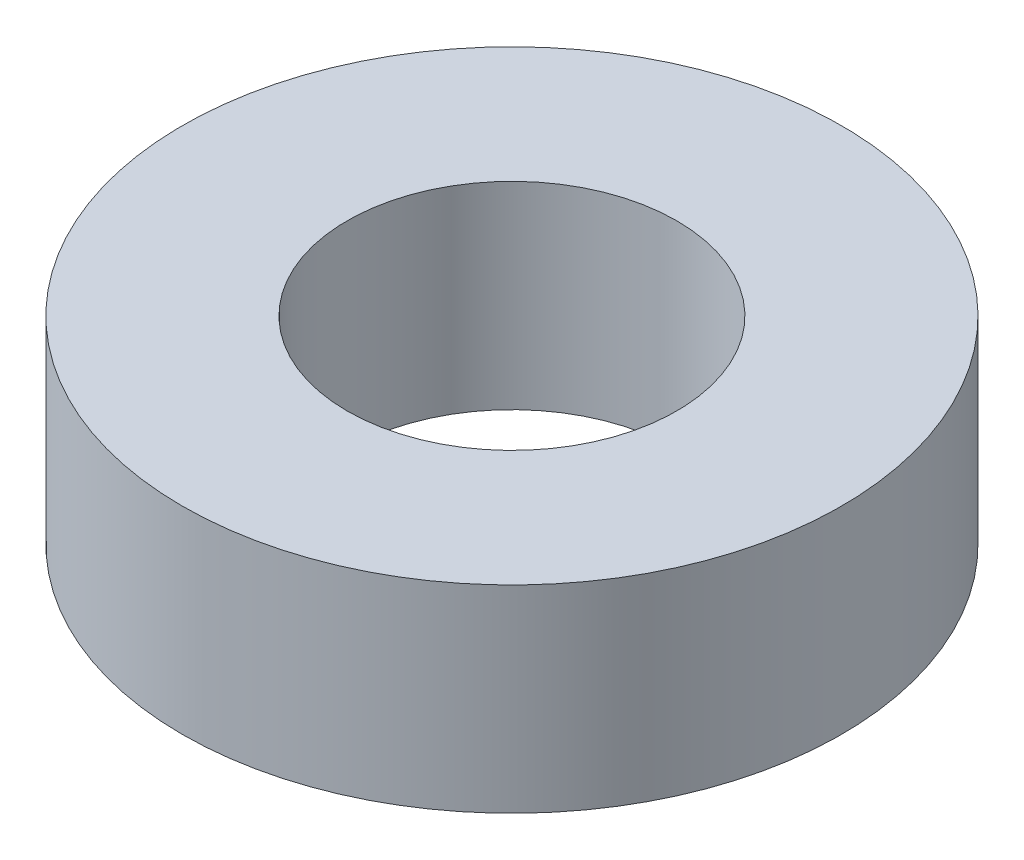
ISO-10303-21;
HEADER;
FILE_DESCRIPTION(('STEP AP214'),'2;1');
FILE_NAME('part.step','',(''),(''),'','','');
FILE_SCHEMA(('AUTOMOTIVE_DESIGN { 1 0 10303 214 1 1 1 1 }'));
ENDSEC;
DATA;
#1=APPLICATION_CONTEXT('core data for automotive mechanical design processes');
#2=APPLICATION_PROTOCOL_DEFINITION('international standard','automotive_design',2000,#1);
#3=PRODUCT_CONTEXT('',#1,'mechanical');
#4=PRODUCT('Part','Part','',(#3));
#5=PRODUCT_RELATED_PRODUCT_CATEGORY('part','',(#4));
#6=PRODUCT_DEFINITION_FORMATION('','',#4);
#7=PRODUCT_DEFINITION_CONTEXT('part definition',#1,'design');
#8=PRODUCT_DEFINITION('design','',#6,#7);
#9=PRODUCT_DEFINITION_SHAPE('','',#8);
#10=(LENGTH_UNIT() NAMED_UNIT(*) SI_UNIT(.MILLI.,.METRE.));
#11=(NAMED_UNIT(*) PLANE_ANGLE_UNIT() SI_UNIT($,.RADIAN.));
#12=(NAMED_UNIT(*) SI_UNIT($,.STERADIAN.) SOLID_ANGLE_UNIT());
#13=UNCERTAINTY_MEASURE_WITH_UNIT(LENGTH_MEASURE(1.E-05),#10,'distance_accuracy_value','');
#14=(GEOMETRIC_REPRESENTATION_CONTEXT(3) GLOBAL_UNCERTAINTY_ASSIGNED_CONTEXT((#13)) GLOBAL_UNIT_ASSIGNED_CONTEXT((#10,
#11,#12)) REPRESENTATION_CONTEXT('',''));
#15=CARTESIAN_POINT('',(0.,0.,0.));
#16=DIRECTION('',(0.,0.,1.));
#17=DIRECTION('',(1.,0.,0.));
#18=AXIS2_PLACEMENT_3D('',#15,#16,#17);
#19=CARTESIAN_POINT('',(0.,3.,0.));
#20=DIRECTION('',(0.,1.,0.));
#21=DIRECTION('',(0.,0.,1.));
#22=AXIS2_PLACEMENT_3D('',#19,#20,#21);
#23=PLANE('',#22);
#24=CARTESIAN_POINT('',(0.,3.,0.));
#25=DIRECTION('',(0.,1.,0.));
#26=DIRECTION('',(0.,0.,1.));
#27=AXIS2_PLACEMENT_3D('',#24,#25,#26);
#28=CIRCLE('',#27,5.);
#29=CARTESIAN_POINT('',(0.,3.,5.));
#30=VERTEX_POINT('',#29);
#31=EDGE_CURVE('E10',#30,#30,#28,.T.);
#32=ORIENTED_EDGE('',*,*,#31,.T.);
#33=EDGE_LOOP('',(#32));
#34=FACE_BOUND('',#33,.T.);
#35=CARTESIAN_POINT('',(0.,3.,0.));
#36=DIRECTION('',(0.,1.,0.));
#37=DIRECTION('',(0.,0.,1.));
#38=AXIS2_PLACEMENT_3D('',#35,#36,#37);
#39=CIRCLE('',#38,2.5);
#40=CARTESIAN_POINT('',(0.,3.,2.5));
#41=VERTEX_POINT('',#40);
#42=EDGE_CURVE('E54',#41,#41,#39,.T.);
#43=ORIENTED_EDGE('',*,*,#42,.F.);
#44=EDGE_LOOP('',(#43));
#45=FACE_BOUND('',#44,.T.);
#46=ADVANCED_FACE('F41',(#34,#45),#23,.T.);
#47=CARTESIAN_POINT('',(0.,0.,0.));
#48=DIRECTION('',(0.,1.,0.));
#49=DIRECTION('',(0.,0.,1.));
#50=AXIS2_PLACEMENT_3D('',#47,#48,#49);
#51=PLANE('',#50);
#52=CARTESIAN_POINT('',(0.,0.,0.));
#53=DIRECTION('',(0.,1.,0.));
#54=DIRECTION('',(0.,0.,1.));
#55=AXIS2_PLACEMENT_3D('',#52,#53,#54);
#56=CIRCLE('',#55,5.);
#57=CARTESIAN_POINT('',(0.,0.,5.));
#58=VERTEX_POINT('',#57);
#59=EDGE_CURVE('E45',#58,#58,#56,.T.);
#60=ORIENTED_EDGE('',*,*,#59,.F.);
#61=EDGE_LOOP('',(#60));
#62=FACE_BOUND('',#61,.T.);
#63=CARTESIAN_POINT('',(0.,0.,0.));
#64=DIRECTION('',(0.,1.,0.));
#65=DIRECTION('',(0.,0.,1.));
#66=AXIS2_PLACEMENT_3D('',#63,#64,#65);
#67=CIRCLE('',#66,2.5);
#68=CARTESIAN_POINT('',(0.,0.,2.5));
#69=VERTEX_POINT('',#68);
#70=EDGE_CURVE('E56',#69,#69,#67,.T.);
#71=ORIENTED_EDGE('',*,*,#70,.T.);
#72=EDGE_LOOP('',(#71));
#73=FACE_BOUND('',#72,.T.);
#74=ADVANCED_FACE('F68',(#62,#73),#51,.F.);
#75=CARTESIAN_POINT('',(0.,3.,0.));
#76=DIRECTION('',(0.,-1.,0.));
#77=DIRECTION('',(0.,0.,-1.));
#78=AXIS2_PLACEMENT_3D('',#75,#76,#77);
#79=CYLINDRICAL_SURFACE('',#78,5.);
#80=ORIENTED_EDGE('',*,*,#31,.F.);
#81=EDGE_LOOP('',(#80));
#82=FACE_BOUND('',#81,.T.);
#83=ORIENTED_EDGE('',*,*,#59,.T.);
#84=EDGE_LOOP('',(#83));
#85=FACE_BOUND('',#84,.T.);
#86=ADVANCED_FACE('F43',(#82,#85),#79,.T.);
#87=CARTESIAN_POINT('',(0.,3.,0.));
#88=DIRECTION('',(0.,-1.,0.));
#89=DIRECTION('',(0.,0.,-1.));
#90=AXIS2_PLACEMENT_3D('',#87,#88,#89);
#91=CYLINDRICAL_SURFACE('',#90,2.5);
#92=ORIENTED_EDGE('',*,*,#42,.T.);
#93=EDGE_LOOP('',(#92));
#94=FACE_BOUND('',#93,.T.);
#95=ORIENTED_EDGE('',*,*,#70,.F.);
#96=EDGE_LOOP('',(#95));
#97=FACE_BOUND('',#96,.T.);
#98=ADVANCED_FACE('F64',(#94,#97),#91,.F.);
#99=CLOSED_SHELL('',(#46,#74,#86,#98));
#100=MANIFOLD_SOLID_BREP('B2',#99);
#101=ADVANCED_BREP_SHAPE_REPRESENTATION('',(#18,#100),#14);
#102=SHAPE_DEFINITION_REPRESENTATION(#9,#101);
ENDSEC;
END-ISO-10303-21;
